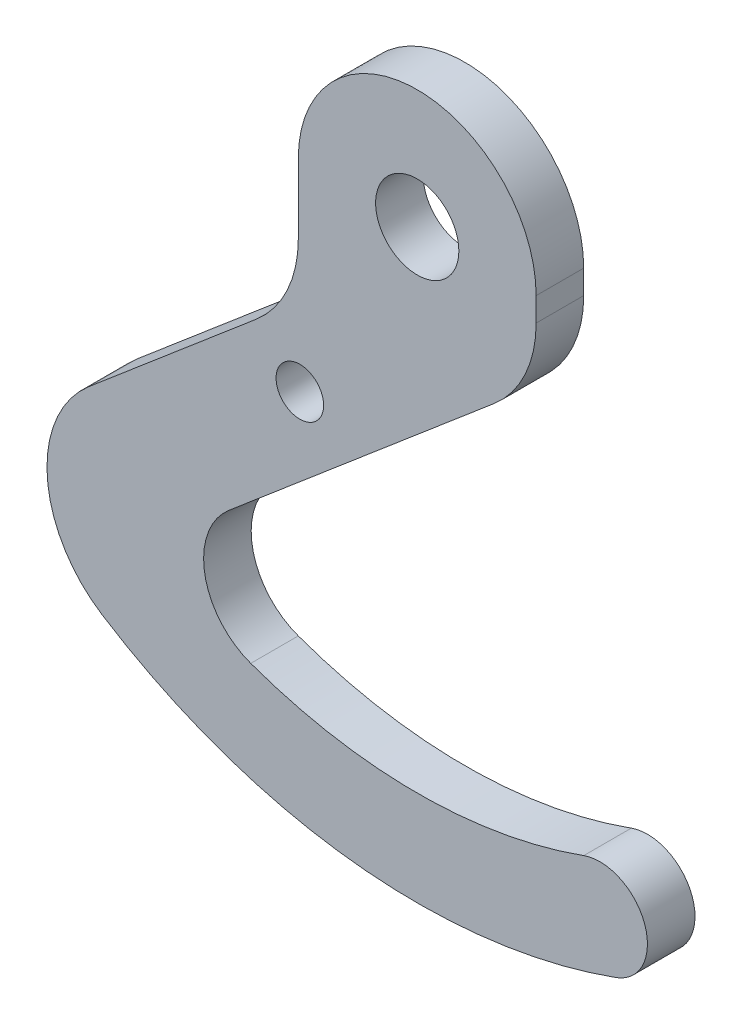
ISO-10303-21;
HEADER;
FILE_DESCRIPTION(('STEP AP214'),'2;1');
FILE_NAME('part.step','',(''),(''),'','','');
FILE_SCHEMA(('AUTOMOTIVE_DESIGN { 1 0 10303 214 1 1 1 1 }'));
ENDSEC;
DATA;
#1=APPLICATION_CONTEXT('core data for automotive mechanical design processes');
#2=APPLICATION_PROTOCOL_DEFINITION('international standard','automotive_design',2000,#1);
#3=PRODUCT_CONTEXT('',#1,'mechanical');
#4=PRODUCT('Part','Part','',(#3));
#5=PRODUCT_RELATED_PRODUCT_CATEGORY('part','',(#4));
#6=PRODUCT_DEFINITION_FORMATION('','',#4);
#7=PRODUCT_DEFINITION_CONTEXT('part definition',#1,'design');
#8=PRODUCT_DEFINITION('design','',#6,#7);
#9=PRODUCT_DEFINITION_SHAPE('','',#8);
#10=(LENGTH_UNIT() NAMED_UNIT(*) SI_UNIT(.MILLI.,.METRE.));
#11=(NAMED_UNIT(*) PLANE_ANGLE_UNIT() SI_UNIT($,.RADIAN.));
#12=(NAMED_UNIT(*) SI_UNIT($,.STERADIAN.) SOLID_ANGLE_UNIT());
#13=UNCERTAINTY_MEASURE_WITH_UNIT(LENGTH_MEASURE(1.E-05),#10,'distance_accuracy_value','');
#14=(GEOMETRIC_REPRESENTATION_CONTEXT(3) GLOBAL_UNCERTAINTY_ASSIGNED_CONTEXT((#13)) GLOBAL_UNIT_ASSIGNED_CONTEXT((#10,
#11,#12)) REPRESENTATION_CONTEXT('',''));
#15=CARTESIAN_POINT('',(0.,0.,0.));
#16=DIRECTION('',(0.,0.,1.));
#17=DIRECTION('',(1.,0.,0.));
#18=AXIS2_PLACEMENT_3D('',#15,#16,#17);
#19=CARTESIAN_POINT('',(-5.9813503748474,-16.5689552755985,1.));
#20=DIRECTION('',(0.,0.,-1.));
#21=DIRECTION('',(-1.,0.,0.));
#22=AXIS2_PLACEMENT_3D('',#19,#20,#21);
#23=PLANE('',#22);
#24=CARTESIAN_POINT('',(-5.9813503748474,-16.5689552755985,1.));
#25=DIRECTION('',(0.,0.,-1.));
#26=DIRECTION('',(-1.,0.,0.));
#27=AXIS2_PLACEMENT_3D('',#24,#25,#26);
#28=CIRCLE('',#27,3.);
#29=CARTESIAN_POINT('',(-7.00000000000001,-19.3907194296653,1.));
#30=VERTEX_POINT('',#29);
#31=CARTESIAN_POINT('',(-7.92254403846361,-14.2816496203927,1.));
#32=VERTEX_POINT('',#31);
#33=EDGE_CURVE('E177',#30,#32,#28,.T.);
#34=ORIENTED_EDGE('',*,*,#33,.T.);
#35=DIRECTION('',(0.762435218401924,0.647064554538734,0.));
#36=VECTOR('',#35,1.);
#37=CARTESIAN_POINT('',(3.23532277269367,-4.81217609200962,1.));
#38=LINE('',#37,#36);
#39=CARTESIAN_POINT('',(3.23532277269367,-4.81217609200962,1.));
#40=VERTEX_POINT('',#39);
#41=EDGE_CURVE('E105',#32,#40,#38,.T.);
#42=ORIENTED_EDGE('',*,*,#41,.T.);
#43=CARTESIAN_POINT('',(0.,-1.,1.));
#44=DIRECTION('',(0.,0.,1.));
#45=DIRECTION('',(1.,0.,0.));
#46=AXIS2_PLACEMENT_3D('',#43,#44,#45);
#47=CIRCLE('',#46,5.);
#48=CARTESIAN_POINT('',(5.,-0.999999999999999,1.));
#49=VERTEX_POINT('',#48);
#50=EDGE_CURVE('E204',#40,#49,#47,.T.);
#51=ORIENTED_EDGE('',*,*,#50,.T.);
#52=DIRECTION('',(0.,1.,0.));
#53=VECTOR('',#52,1.);
#54=CARTESIAN_POINT('',(5.,0.,1.));
#55=LINE('',#54,#53);
#56=CARTESIAN_POINT('',(5.,0.,1.));
#57=VERTEX_POINT('',#56);
#58=EDGE_CURVE('E223',#49,#57,#55,.T.);
#59=ORIENTED_EDGE('',*,*,#58,.T.);
#60=CARTESIAN_POINT('',(0.,0.,1.));
#61=DIRECTION('',(0.,0.,1.));
#62=DIRECTION('',(1.,0.,0.));
#63=AXIS2_PLACEMENT_3D('',#60,#61,#62);
#64=CIRCLE('',#63,5.);
#65=CARTESIAN_POINT('',(-5.,0.,1.));
#66=VERTEX_POINT('',#65);
#67=EDGE_CURVE('E220',#57,#66,#64,.T.);
#68=ORIENTED_EDGE('',*,*,#67,.T.);
#69=DIRECTION('',(0.,-1.,0.));
#70=VECTOR('',#69,1.);
#71=CARTESIAN_POINT('',(-5.,0.,1.));
#72=LINE('',#71,#70);
#73=CARTESIAN_POINT('',(-5.,-2.92887934593293,1.));
#74=VERTEX_POINT('',#73);
#75=EDGE_CURVE('E222',#66,#74,#72,.T.);
#76=ORIENTED_EDGE('',*,*,#75,.T.);
#77=CARTESIAN_POINT('',(-10.,-2.92887934593293,1.));
#78=DIRECTION('',(0.,0.,-1.));
#79=DIRECTION('',(1.,0.,0.));
#80=AXIS2_PLACEMENT_3D('',#77,#78,#79);
#81=CIRCLE('',#80,5.);
#82=CARTESIAN_POINT('',(-6.76467722730633,-6.74105543794256,1.));
#83=VERTEX_POINT('',#82);
#84=EDGE_CURVE('E225',#74,#83,#81,.T.);
#85=ORIENTED_EDGE('',*,*,#84,.T.);
#86=DIRECTION('',(-0.762435218401925,-0.647064554538734,0.));
#87=VECTOR('',#86,1.);
#88=CARTESIAN_POINT('',(-6.76467722730633,-6.74105543794256,1.));
#89=LINE('',#88,#87);
#90=CARTESIAN_POINT('',(-13.8023314820295,-12.7137813894994,1.));
#91=VERTEX_POINT('',#90);
#92=EDGE_CURVE('E231',#83,#91,#89,.T.);
#93=ORIENTED_EDGE('',*,*,#92,.T.);
#94=CARTESIAN_POINT('',(-10.5670087093358,-16.525957481509,1.));
#95=DIRECTION('',(0.,0.,1.));
#96=DIRECTION('',(-1.,0.,0.));
#97=AXIS2_PLACEMENT_3D('',#94,#95,#96);
#98=CIRCLE('',#97,5.);
#99=CARTESIAN_POINT('',(-13.2605402421944,-20.7384256275603,1.));
#100=VERTEX_POINT('',#99);
#101=EDGE_CURVE('E136',#91,#100,#98,.T.);
#102=ORIENTED_EDGE('',*,*,#101,.T.);
#103=CARTESIAN_POINT('',(0.,0.,1.));
#104=DIRECTION('',(0.,0.,1.));
#105=DIRECTION('',(1.,0.,0.));
#106=AXIS2_PLACEMENT_3D('',#103,#104,#105);
#107=CIRCLE('',#106,24.6155281280883);
#108=CARTESIAN_POINT('',(8.35819950020347,-23.1530716350878,1.));
#109=VERTEX_POINT('',#108);
#110=EDGE_CURVE('E130',#100,#109,#107,.T.);
#111=ORIENTED_EDGE('',*,*,#110,.T.);
#112=CARTESIAN_POINT('',(7.67909975010173,-21.2718955323765,1.));
#113=DIRECTION('',(0.,0.,1.));
#114=DIRECTION('',(1.,0.,0.));
#115=AXIS2_PLACEMENT_3D('',#112,#113,#114);
#116=CIRCLE('',#115,2.);
#117=CARTESIAN_POINT('',(7.,-19.3907194296653,1.));
#118=VERTEX_POINT('',#117);
#119=EDGE_CURVE('E134',#109,#118,#116,.T.);
#120=ORIENTED_EDGE('',*,*,#119,.T.);
#121=CARTESIAN_POINT('',(0.,0.,1.));
#122=DIRECTION('',(0.,0.,-1.));
#123=DIRECTION('',(1.,0.,0.));
#124=AXIS2_PLACEMENT_3D('',#121,#122,#123);
#125=CIRCLE('',#124,20.6155281280883);
#126=EDGE_CURVE('E50',#118,#30,#125,.T.);
#127=ORIENTED_EDGE('',*,*,#126,.T.);
#128=EDGE_LOOP('',(#34,#42,#51,#59,#68,#76,#85,#93,#102,#111,#120,#127));
#129=FACE_BOUND('',#128,.T.);
#130=CARTESIAN_POINT('',(0.,0.,1.));
#131=DIRECTION('',(0.,0.,1.));
#132=DIRECTION('',(1.,0.,0.));
#133=AXIS2_PLACEMENT_3D('',#130,#131,#132);
#134=CIRCLE('',#133,1.75);
#135=CARTESIAN_POINT('',(1.75,0.,1.));
#136=VERTEX_POINT('',#135);
#137=EDGE_CURVE('E158',#136,#136,#134,.T.);
#138=ORIENTED_EDGE('',*,*,#137,.F.);
#139=EDGE_LOOP('',(#138));
#140=FACE_BOUND('',#139,.T.);
#141=CARTESIAN_POINT('',(-4.93569897467115,-8.46780279945225,1.));
#142=DIRECTION('',(0.,0.,1.));
#143=DIRECTION('',(1.,0.,0.));
#144=AXIS2_PLACEMENT_3D('',#141,#142,#143);
#145=CIRCLE('',#144,1.);
#146=CARTESIAN_POINT('',(-3.93569897467115,-8.46780279945225,1.));
#147=VERTEX_POINT('',#146);
#148=EDGE_CURVE('E272',#147,#147,#145,.T.);
#149=ORIENTED_EDGE('',*,*,#148,.F.);
#150=EDGE_LOOP('',(#149));
#151=FACE_BOUND('',#150,.T.);
#152=ADVANCED_FACE('F33',(#129,#140,#151),#23,.F.);
#153=CARTESIAN_POINT('',(-5.9813503748474,-16.5689552755985,-1.));
#154=DIRECTION('',(0.,0.,-1.));
#155=DIRECTION('',(-1.,0.,0.));
#156=AXIS2_PLACEMENT_3D('',#153,#154,#155);
#157=PLANE('',#156);
#158=CARTESIAN_POINT('',(0.,0.,-1.));
#159=DIRECTION('',(0.,0.,1.));
#160=DIRECTION('',(1.,0.,0.));
#161=AXIS2_PLACEMENT_3D('',#158,#159,#160);
#162=CIRCLE('',#161,1.75);
#163=CARTESIAN_POINT('',(1.75,0.,-1.));
#164=VERTEX_POINT('',#163);
#165=EDGE_CURVE('E277',#164,#164,#162,.T.);
#166=ORIENTED_EDGE('',*,*,#165,.T.);
#167=EDGE_LOOP('',(#166));
#168=FACE_BOUND('',#167,.T.);
#169=CARTESIAN_POINT('',(-5.9813503748474,-16.5689552755985,-1.));
#170=DIRECTION('',(0.,0.,-1.));
#171=DIRECTION('',(-1.,0.,0.));
#172=AXIS2_PLACEMENT_3D('',#169,#170,#171);
#173=CIRCLE('',#172,3.);
#174=CARTESIAN_POINT('',(-7.00000000000001,-19.3907194296653,-1.));
#175=VERTEX_POINT('',#174);
#176=CARTESIAN_POINT('',(-7.92254403846361,-14.2816496203927,-1.));
#177=VERTEX_POINT('',#176);
#178=EDGE_CURVE('E154',#175,#177,#173,.T.);
#179=ORIENTED_EDGE('',*,*,#178,.F.);
#180=CARTESIAN_POINT('',(0.,0.,-1.));
#181=DIRECTION('',(0.,0.,-1.));
#182=DIRECTION('',(1.,0.,0.));
#183=AXIS2_PLACEMENT_3D('',#180,#181,#182);
#184=CIRCLE('',#183,20.6155281280883);
#185=CARTESIAN_POINT('',(7.,-19.3907194296653,-1.));
#186=VERTEX_POINT('',#185);
#187=EDGE_CURVE('E97',#186,#175,#184,.T.);
#188=ORIENTED_EDGE('',*,*,#187,.F.);
#189=CARTESIAN_POINT('',(7.67909975010173,-21.2718955323765,-1.));
#190=DIRECTION('',(0.,0.,1.));
#191=DIRECTION('',(1.,0.,0.));
#192=AXIS2_PLACEMENT_3D('',#189,#190,#191);
#193=CIRCLE('',#192,2.);
#194=CARTESIAN_POINT('',(8.35819950020347,-23.1530716350878,-1.));
#195=VERTEX_POINT('',#194);
#196=EDGE_CURVE('E91',#195,#186,#193,.T.);
#197=ORIENTED_EDGE('',*,*,#196,.F.);
#198=CARTESIAN_POINT('',(0.,0.,-1.));
#199=DIRECTION('',(0.,0.,1.));
#200=DIRECTION('',(1.,0.,0.));
#201=AXIS2_PLACEMENT_3D('',#198,#199,#200);
#202=CIRCLE('',#201,24.6155281280883);
#203=CARTESIAN_POINT('',(-13.2605402421944,-20.7384256275603,-1.));
#204=VERTEX_POINT('',#203);
#205=EDGE_CURVE('E144',#204,#195,#202,.T.);
#206=ORIENTED_EDGE('',*,*,#205,.F.);
#207=CARTESIAN_POINT('',(-10.5670087093358,-16.525957481509,-1.));
#208=DIRECTION('',(0.,0.,1.));
#209=DIRECTION('',(-1.,0.,0.));
#210=AXIS2_PLACEMENT_3D('',#207,#208,#209);
#211=CIRCLE('',#210,5.);
#212=CARTESIAN_POINT('',(-13.8023314820295,-12.7137813894994,-1.));
#213=VERTEX_POINT('',#212);
#214=EDGE_CURVE('E172',#213,#204,#211,.T.);
#215=ORIENTED_EDGE('',*,*,#214,.F.);
#216=DIRECTION('',(-0.762435218401925,-0.647064554538734,0.));
#217=VECTOR('',#216,1.);
#218=CARTESIAN_POINT('',(-6.76467722730633,-6.74105543794256,-1.));
#219=LINE('',#218,#217);
#220=CARTESIAN_POINT('',(-6.76467722730633,-6.74105543794256,-1.));
#221=VERTEX_POINT('',#220);
#222=EDGE_CURVE('E170',#221,#213,#219,.T.);
#223=ORIENTED_EDGE('',*,*,#222,.F.);
#224=CARTESIAN_POINT('',(-10.,-2.92887934593293,-1.));
#225=DIRECTION('',(0.,0.,-1.));
#226=DIRECTION('',(1.,0.,0.));
#227=AXIS2_PLACEMENT_3D('',#224,#225,#226);
#228=CIRCLE('',#227,5.);
#229=CARTESIAN_POINT('',(-5.,-2.92887934593293,-1.));
#230=VERTEX_POINT('',#229);
#231=EDGE_CURVE('E168',#230,#221,#228,.T.);
#232=ORIENTED_EDGE('',*,*,#231,.F.);
#233=DIRECTION('',(0.,-1.,0.));
#234=VECTOR('',#233,1.);
#235=CARTESIAN_POINT('',(-5.,0.,-1.));
#236=LINE('',#235,#234);
#237=CARTESIAN_POINT('',(-5.,0.,-1.));
#238=VERTEX_POINT('',#237);
#239=EDGE_CURVE('E166',#238,#230,#236,.T.);
#240=ORIENTED_EDGE('',*,*,#239,.F.);
#241=CARTESIAN_POINT('',(0.,0.,-1.));
#242=DIRECTION('',(0.,0.,1.));
#243=DIRECTION('',(1.,0.,0.));
#244=AXIS2_PLACEMENT_3D('',#241,#242,#243);
#245=CIRCLE('',#244,5.);
#246=CARTESIAN_POINT('',(5.,0.,-1.));
#247=VERTEX_POINT('',#246);
#248=EDGE_CURVE('E164',#247,#238,#245,.T.);
#249=ORIENTED_EDGE('',*,*,#248,.F.);
#250=DIRECTION('',(0.,1.,0.));
#251=VECTOR('',#250,1.);
#252=CARTESIAN_POINT('',(5.,0.,-1.));
#253=LINE('',#252,#251);
#254=CARTESIAN_POINT('',(5.,-0.999999999999999,-1.));
#255=VERTEX_POINT('',#254);
#256=EDGE_CURVE('E162',#255,#247,#253,.T.);
#257=ORIENTED_EDGE('',*,*,#256,.F.);
#258=CARTESIAN_POINT('',(0.,-1.,-1.));
#259=DIRECTION('',(0.,0.,1.));
#260=DIRECTION('',(1.,0.,0.));
#261=AXIS2_PLACEMENT_3D('',#258,#259,#260);
#262=CIRCLE('',#261,5.);
#263=CARTESIAN_POINT('',(3.23532277269367,-4.81217609200962,-1.));
#264=VERTEX_POINT('',#263);
#265=EDGE_CURVE('E160',#264,#255,#262,.T.);
#266=ORIENTED_EDGE('',*,*,#265,.F.);
#267=DIRECTION('',(0.762435218401924,0.647064554538734,0.));
#268=VECTOR('',#267,1.);
#269=CARTESIAN_POINT('',(3.23532277269367,-4.81217609200962,-1.));
#270=LINE('',#269,#268);
#271=EDGE_CURVE('E157',#177,#264,#270,.T.);
#272=ORIENTED_EDGE('',*,*,#271,.F.);
#273=EDGE_LOOP('',(#179,#188,#197,#206,#215,#223,#232,#240,#249,#257,#266,#272));
#274=FACE_BOUND('',#273,.T.);
#275=CARTESIAN_POINT('',(-4.93569897467115,-8.46780279945225,-1.));
#276=DIRECTION('',(0.,0.,1.));
#277=DIRECTION('',(1.,0.,0.));
#278=AXIS2_PLACEMENT_3D('',#275,#276,#277);
#279=CIRCLE('',#278,1.);
#280=CARTESIAN_POINT('',(-3.93569897467115,-8.46780279945225,-1.));
#281=VERTEX_POINT('',#280);
#282=EDGE_CURVE('E275',#281,#281,#279,.T.);
#283=ORIENTED_EDGE('',*,*,#282,.T.);
#284=EDGE_LOOP('',(#283));
#285=FACE_BOUND('',#284,.T.);
#286=ADVANCED_FACE('F208',(#168,#274,#285),#157,.T.);
#287=CARTESIAN_POINT('',(-5.9813503748474,-16.5689552755985,1.));
#288=DIRECTION('',(0.,0.,-1.));
#289=DIRECTION('',(-1.,0.,0.));
#290=AXIS2_PLACEMENT_3D('',#287,#288,#289);
#291=CYLINDRICAL_SURFACE('',#290,3.);
#292=ORIENTED_EDGE('',*,*,#178,.T.);
#293=DIRECTION('',(0.,0.,-1.));
#294=VECTOR('',#293,1.);
#295=CARTESIAN_POINT('',(-7.92254403846361,-14.2816496203927,1.));
#296=LINE('',#295,#294);
#297=EDGE_CURVE('E11',#32,#177,#296,.T.);
#298=ORIENTED_EDGE('',*,*,#297,.F.);
#299=ORIENTED_EDGE('',*,*,#33,.F.);
#300=DIRECTION('',(0.,0.,-1.));
#301=VECTOR('',#300,1.);
#302=CARTESIAN_POINT('',(-7.00000000000001,-19.3907194296653,1.));
#303=LINE('',#302,#301);
#304=EDGE_CURVE('E150',#30,#175,#303,.T.);
#305=ORIENTED_EDGE('',*,*,#304,.T.);
#306=EDGE_LOOP('',(#292,#298,#299,#305));
#307=FACE_BOUND('',#306,.T.);
#308=ADVANCED_FACE('F35',(#307),#291,.F.);
#309=CARTESIAN_POINT('',(3.23532277269367,-4.81217609200962,1.));
#310=DIRECTION('',(-0.647064554538734,0.762435218401924,0.));
#311=DIRECTION('',(-0.762435218401924,-0.647064554538734,0.));
#312=AXIS2_PLACEMENT_3D('',#309,#310,#311);
#313=PLANE('',#312);
#314=ORIENTED_EDGE('',*,*,#271,.T.);
#315=DIRECTION('',(0.,0.,-1.));
#316=VECTOR('',#315,1.);
#317=CARTESIAN_POINT('',(3.23532277269367,-4.81217609200962,1.));
#318=LINE('',#317,#316);
#319=EDGE_CURVE('E42',#40,#264,#318,.T.);
#320=ORIENTED_EDGE('',*,*,#319,.F.);
#321=ORIENTED_EDGE('',*,*,#41,.F.);
#322=ORIENTED_EDGE('',*,*,#297,.T.);
#323=EDGE_LOOP('',(#314,#320,#321,#322));
#324=FACE_BOUND('',#323,.T.);
#325=ADVANCED_FACE('F372',(#324),#313,.F.);
#326=CARTESIAN_POINT('',(0.,-1.,1.));
#327=DIRECTION('',(0.,0.,-1.));
#328=DIRECTION('',(-1.,0.,0.));
#329=AXIS2_PLACEMENT_3D('',#326,#327,#328);
#330=CYLINDRICAL_SURFACE('',#329,5.);
#331=ORIENTED_EDGE('',*,*,#265,.T.);
#332=DIRECTION('',(0.,0.,-1.));
#333=VECTOR('',#332,1.);
#334=CARTESIAN_POINT('',(5.,-0.999999999999999,1.));
#335=LINE('',#334,#333);
#336=EDGE_CURVE('E196',#49,#255,#335,.T.);
#337=ORIENTED_EDGE('',*,*,#336,.F.);
#338=ORIENTED_EDGE('',*,*,#50,.F.);
#339=ORIENTED_EDGE('',*,*,#319,.T.);
#340=EDGE_LOOP('',(#331,#337,#338,#339));
#341=FACE_BOUND('',#340,.T.);
#342=ADVANCED_FACE('F202',(#341),#330,.T.);
#343=CARTESIAN_POINT('',(5.,0.,1.));
#344=DIRECTION('',(-1.,0.,0.));
#345=DIRECTION('',(0.,-1.,0.));
#346=AXIS2_PLACEMENT_3D('',#343,#344,#345);
#347=PLANE('',#346);
#348=ORIENTED_EDGE('',*,*,#256,.T.);
#349=DIRECTION('',(0.,0.,-1.));
#350=VECTOR('',#349,1.);
#351=CARTESIAN_POINT('',(5.,0.,1.));
#352=LINE('',#351,#350);
#353=EDGE_CURVE('E193',#57,#247,#352,.T.);
#354=ORIENTED_EDGE('',*,*,#353,.F.);
#355=ORIENTED_EDGE('',*,*,#58,.F.);
#356=ORIENTED_EDGE('',*,*,#336,.T.);
#357=EDGE_LOOP('',(#348,#354,#355,#356));
#358=FACE_BOUND('',#357,.T.);
#359=ADVANCED_FACE('F214',(#358),#347,.F.);
#360=CARTESIAN_POINT('',(0.,0.,1.));
#361=DIRECTION('',(0.,0.,-1.));
#362=DIRECTION('',(-1.,0.,0.));
#363=AXIS2_PLACEMENT_3D('',#360,#361,#362);
#364=CYLINDRICAL_SURFACE('',#363,5.);
#365=ORIENTED_EDGE('',*,*,#248,.T.);
#366=DIRECTION('',(0.,0.,-1.));
#367=VECTOR('',#366,1.);
#368=CARTESIAN_POINT('',(-5.,0.,1.));
#369=LINE('',#368,#367);
#370=EDGE_CURVE('E190',#66,#238,#369,.T.);
#371=ORIENTED_EDGE('',*,*,#370,.F.);
#372=ORIENTED_EDGE('',*,*,#67,.F.);
#373=ORIENTED_EDGE('',*,*,#353,.T.);
#374=EDGE_LOOP('',(#365,#371,#372,#373));
#375=FACE_BOUND('',#374,.T.);
#376=ADVANCED_FACE('F218',(#375),#364,.T.);
#377=CARTESIAN_POINT('',(-5.,0.,1.));
#378=DIRECTION('',(1.,0.,0.));
#379=DIRECTION('',(0.,1.,0.));
#380=AXIS2_PLACEMENT_3D('',#377,#378,#379);
#381=PLANE('',#380);
#382=ORIENTED_EDGE('',*,*,#239,.T.);
#383=DIRECTION('',(0.,0.,-1.));
#384=VECTOR('',#383,1.);
#385=CARTESIAN_POINT('',(-5.,-2.92887934593293,1.));
#386=LINE('',#385,#384);
#387=EDGE_CURVE('E187',#74,#230,#386,.T.);
#388=ORIENTED_EDGE('',*,*,#387,.F.);
#389=ORIENTED_EDGE('',*,*,#75,.F.);
#390=ORIENTED_EDGE('',*,*,#370,.T.);
#391=EDGE_LOOP('',(#382,#388,#389,#390));
#392=FACE_BOUND('',#391,.T.);
#393=ADVANCED_FACE('F337',(#392),#381,.F.);
#394=CARTESIAN_POINT('',(-10.,-2.92887934593293,1.));
#395=DIRECTION('',(0.,0.,-1.));
#396=DIRECTION('',(-1.,0.,0.));
#397=AXIS2_PLACEMENT_3D('',#394,#395,#396);
#398=CYLINDRICAL_SURFACE('',#397,5.);
#399=ORIENTED_EDGE('',*,*,#231,.T.);
#400=DIRECTION('',(0.,0.,-1.));
#401=VECTOR('',#400,1.);
#402=CARTESIAN_POINT('',(-6.76467722730633,-6.74105543794256,1.));
#403=LINE('',#402,#401);
#404=EDGE_CURVE('E184',#83,#221,#403,.T.);
#405=ORIENTED_EDGE('',*,*,#404,.F.);
#406=ORIENTED_EDGE('',*,*,#84,.F.);
#407=ORIENTED_EDGE('',*,*,#387,.T.);
#408=EDGE_LOOP('',(#399,#405,#406,#407));
#409=FACE_BOUND('',#408,.T.);
#410=ADVANCED_FACE('F328',(#409),#398,.F.);
#411=CARTESIAN_POINT('',(-6.76467722730633,-6.74105543794256,1.));
#412=DIRECTION('',(0.647064554538734,-0.762435218401924,0.));
#413=DIRECTION('',(0.762435218401925,0.647064554538734,0.));
#414=AXIS2_PLACEMENT_3D('',#411,#412,#413);
#415=PLANE('',#414);
#416=ORIENTED_EDGE('',*,*,#222,.T.);
#417=DIRECTION('',(0.,0.,-1.));
#418=VECTOR('',#417,1.);
#419=CARTESIAN_POINT('',(-13.8023314820295,-12.7137813894994,1.));
#420=LINE('',#419,#418);
#421=EDGE_CURVE('E181',#91,#213,#420,.T.);
#422=ORIENTED_EDGE('',*,*,#421,.F.);
#423=ORIENTED_EDGE('',*,*,#92,.F.);
#424=ORIENTED_EDGE('',*,*,#404,.T.);
#425=EDGE_LOOP('',(#416,#422,#423,#424));
#426=FACE_BOUND('',#425,.T.);
#427=ADVANCED_FACE('F237',(#426),#415,.F.);
#428=CARTESIAN_POINT('',(-10.5670087093358,-16.525957481509,1.));
#429=DIRECTION('',(0.,0.,-1.));
#430=DIRECTION('',(-1.,0.,0.));
#431=AXIS2_PLACEMENT_3D('',#428,#429,#430);
#432=CYLINDRICAL_SURFACE('',#431,5.);
#433=ORIENTED_EDGE('',*,*,#214,.T.);
#434=DIRECTION('',(0.,0.,-1.));
#435=VECTOR('',#434,1.);
#436=CARTESIAN_POINT('',(-13.2605402421944,-20.7384256275603,1.));
#437=LINE('',#436,#435);
#438=EDGE_CURVE('E145',#100,#204,#437,.T.);
#439=ORIENTED_EDGE('',*,*,#438,.F.);
#440=ORIENTED_EDGE('',*,*,#101,.F.);
#441=ORIENTED_EDGE('',*,*,#421,.T.);
#442=EDGE_LOOP('',(#433,#439,#440,#441));
#443=FACE_BOUND('',#442,.T.);
#444=ADVANCED_FACE('F241',(#443),#432,.T.);
#445=CARTESIAN_POINT('',(0.,0.,1.));
#446=DIRECTION('',(0.,0.,-1.));
#447=DIRECTION('',(-1.,0.,0.));
#448=AXIS2_PLACEMENT_3D('',#445,#446,#447);
#449=CYLINDRICAL_SURFACE('',#448,24.6155281280883);
#450=ORIENTED_EDGE('',*,*,#205,.T.);
#451=DIRECTION('',(0.,0.,-1.));
#452=VECTOR('',#451,1.);
#453=CARTESIAN_POINT('',(8.35819950020347,-23.1530716350878,1.));
#454=LINE('',#453,#452);
#455=EDGE_CURVE('E141',#109,#195,#454,.T.);
#456=ORIENTED_EDGE('',*,*,#455,.F.);
#457=ORIENTED_EDGE('',*,*,#110,.F.);
#458=ORIENTED_EDGE('',*,*,#438,.T.);
#459=EDGE_LOOP('',(#450,#456,#457,#458));
#460=FACE_BOUND('',#459,.T.);
#461=ADVANCED_FACE('F142',(#460),#449,.T.);
#462=CARTESIAN_POINT('',(7.67909975010173,-21.2718955323765,1.));
#463=DIRECTION('',(0.,0.,-1.));
#464=DIRECTION('',(-1.,0.,0.));
#465=AXIS2_PLACEMENT_3D('',#462,#463,#464);
#466=CYLINDRICAL_SURFACE('',#465,2.);
#467=ORIENTED_EDGE('',*,*,#196,.T.);
#468=DIRECTION('',(0.,0.,-1.));
#469=VECTOR('',#468,1.);
#470=CARTESIAN_POINT('',(7.,-19.3907194296653,1.));
#471=LINE('',#470,#469);
#472=EDGE_CURVE('E146',#118,#186,#471,.T.);
#473=ORIENTED_EDGE('',*,*,#472,.F.);
#474=ORIENTED_EDGE('',*,*,#119,.F.);
#475=ORIENTED_EDGE('',*,*,#455,.T.);
#476=EDGE_LOOP('',(#467,#473,#474,#475));
#477=FACE_BOUND('',#476,.T.);
#478=ADVANCED_FACE('F148',(#477),#466,.T.);
#479=CARTESIAN_POINT('',(0.,0.,1.));
#480=DIRECTION('',(0.,0.,-1.));
#481=DIRECTION('',(-1.,0.,0.));
#482=AXIS2_PLACEMENT_3D('',#479,#480,#481);
#483=CYLINDRICAL_SURFACE('',#482,20.6155281280883);
#484=ORIENTED_EDGE('',*,*,#187,.T.);
#485=ORIENTED_EDGE('',*,*,#304,.F.);
#486=ORIENTED_EDGE('',*,*,#126,.F.);
#487=ORIENTED_EDGE('',*,*,#472,.T.);
#488=EDGE_LOOP('',(#484,#485,#486,#487));
#489=FACE_BOUND('',#488,.T.);
#490=ADVANCED_FACE('F245',(#489),#483,.F.);
#491=CARTESIAN_POINT('',(0.,0.,1.));
#492=DIRECTION('',(0.,0.,-1.));
#493=DIRECTION('',(-1.,0.,0.));
#494=AXIS2_PLACEMENT_3D('',#491,#492,#493);
#495=CYLINDRICAL_SURFACE('',#494,1.75);
#496=ORIENTED_EDGE('',*,*,#137,.T.);
#497=EDGE_LOOP('',(#496));
#498=FACE_BOUND('',#497,.T.);
#499=ORIENTED_EDGE('',*,*,#165,.F.);
#500=EDGE_LOOP('',(#499));
#501=FACE_BOUND('',#500,.T.);
#502=ADVANCED_FACE('F247',(#498,#501),#495,.F.);
#503=CARTESIAN_POINT('',(-4.93569897467115,-8.46780279945225,1.));
#504=DIRECTION('',(0.,0.,-1.));
#505=DIRECTION('',(-1.,0.,0.));
#506=AXIS2_PLACEMENT_3D('',#503,#504,#505);
#507=CYLINDRICAL_SURFACE('',#506,1.);
#508=ORIENTED_EDGE('',*,*,#148,.T.);
#509=EDGE_LOOP('',(#508));
#510=FACE_BOUND('',#509,.T.);
#511=ORIENTED_EDGE('',*,*,#282,.F.);
#512=EDGE_LOOP('',(#511));
#513=FACE_BOUND('',#512,.T.);
#514=ADVANCED_FACE('F253',(#510,#513),#507,.F.);
#515=CLOSED_SHELL('',(#152,#286,#308,#325,#342,#359,#376,#393,#410,#427,#444,#461,#478,#490,
#502,#514));
#516=MANIFOLD_SOLID_BREP('B2',#515);
#517=ADVANCED_BREP_SHAPE_REPRESENTATION('',(#18,#516),#14);
#518=SHAPE_DEFINITION_REPRESENTATION(#9,#517);
ENDSEC;
END-ISO-10303-21;
